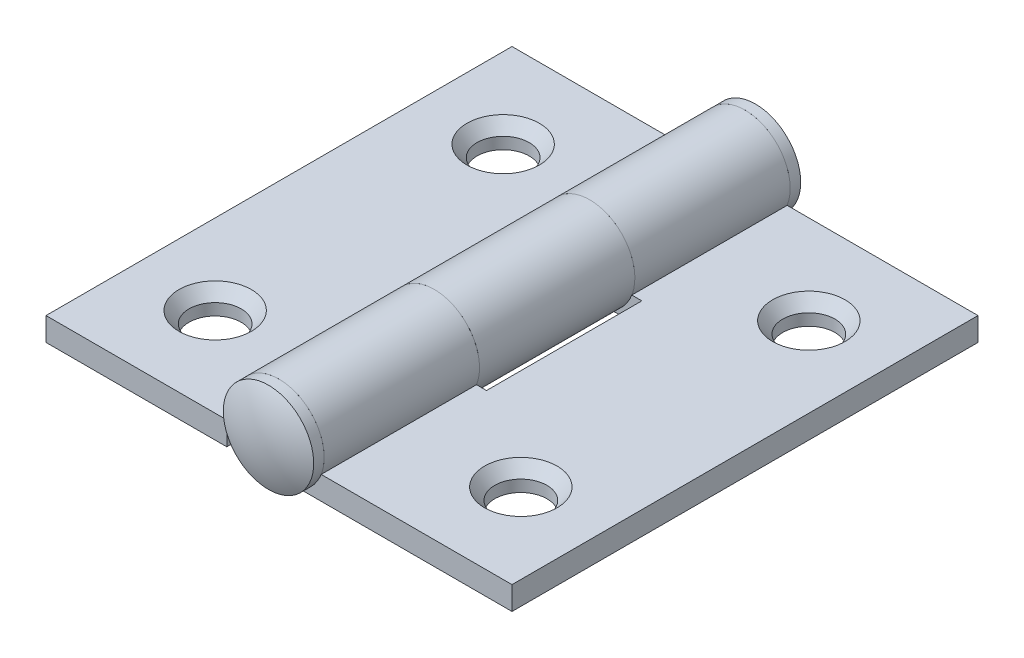
ISO-10303-21;
HEADER;
FILE_DESCRIPTION(('STEP AP214'),'2;1');
FILE_NAME('part.step','',(''),(''),'','','');
FILE_SCHEMA(('AUTOMOTIVE_DESIGN { 1 0 10303 214 1 1 1 1 }'));
ENDSEC;
DATA;
#1=APPLICATION_CONTEXT('core data for automotive mechanical design processes');
#2=APPLICATION_PROTOCOL_DEFINITION('international standard','automotive_design',2000,#1);
#3=PRODUCT_CONTEXT('',#1,'mechanical');
#4=PRODUCT('Part','Part','',(#3));
#5=PRODUCT_RELATED_PRODUCT_CATEGORY('part','',(#4));
#6=PRODUCT_DEFINITION_FORMATION('','',#4);
#7=PRODUCT_DEFINITION_CONTEXT('part definition',#1,'design');
#8=PRODUCT_DEFINITION('design','',#6,#7);
#9=PRODUCT_DEFINITION_SHAPE('','',#8);
#10=(LENGTH_UNIT() NAMED_UNIT(*) SI_UNIT(.MILLI.,.METRE.));
#11=(NAMED_UNIT(*) PLANE_ANGLE_UNIT() SI_UNIT($,.RADIAN.));
#12=(NAMED_UNIT(*) SI_UNIT($,.STERADIAN.) SOLID_ANGLE_UNIT());
#13=UNCERTAINTY_MEASURE_WITH_UNIT(LENGTH_MEASURE(1.E-05),#10,'distance_accuracy_value','');
#14=(GEOMETRIC_REPRESENTATION_CONTEXT(3) GLOBAL_UNCERTAINTY_ASSIGNED_CONTEXT((#13)) GLOBAL_UNIT_ASSIGNED_CONTEXT((#10,
#11,#12)) REPRESENTATION_CONTEXT('',''));
#15=CARTESIAN_POINT('',(0.,0.,0.));
#16=DIRECTION('',(0.,0.,1.));
#17=DIRECTION('',(1.,0.,0.));
#18=AXIS2_PLACEMENT_3D('',#15,#16,#17);
#19=CARTESIAN_POINT('',(0.,0.,-8.24639222222225));
#20=DIRECTION('',(0.,0.,-1.));
#21=DIRECTION('',(1.,0.,0.));
#22=AXIS2_PLACEMENT_3D('',#19,#20,#21);
#23=SPHERICAL_SURFACE('',#22,5.59660777777775);
#24=CARTESIAN_POINT('',(0.,0.,-13.2715));
#25=DIRECTION('',(0.,0.,-1.));
#26=DIRECTION('',(-1.,0.,0.));
#27=AXIS2_PLACEMENT_3D('',#24,#25,#26);
#28=CIRCLE('',#27,2.4638);
#29=CARTESIAN_POINT('',(-2.4638,0.,-13.2715));
#30=VERTEX_POINT('',#29);
#31=EDGE_CURVE('E70',#30,#30,#28,.T.);
#32=ORIENTED_EDGE('',*,*,#31,.T.);
#33=EDGE_LOOP('',(#32));
#34=FACE_BOUND('',#33,.T.);
#35=ADVANCED_FACE('F48',(#34),#23,.T.);
#36=CARTESIAN_POINT('',(0.,0.,8.24639222222225));
#37=DIRECTION('',(0.,0.,-1.));
#38=DIRECTION('',(-1.,0.,0.));
#39=AXIS2_PLACEMENT_3D('',#36,#37,#38);
#40=SPHERICAL_SURFACE('',#39,5.59660777777775);
#41=CARTESIAN_POINT('',(0.,0.,13.2715));
#42=DIRECTION('',(0.,0.,-1.));
#43=DIRECTION('',(-1.,0.,0.));
#44=AXIS2_PLACEMENT_3D('',#41,#42,#43);
#45=CIRCLE('',#44,2.4638);
#46=CARTESIAN_POINT('',(-2.4638,0.,13.2715));
#47=VERTEX_POINT('',#46);
#48=EDGE_CURVE('E11',#47,#47,#45,.T.);
#49=ORIENTED_EDGE('',*,*,#48,.F.);
#50=EDGE_LOOP('',(#49));
#51=FACE_BOUND('',#50,.T.);
#52=ADVANCED_FACE('F87',(#51),#40,.T.);
#53=CARTESIAN_POINT('',(0.,0.,-13.843));
#54=DIRECTION('',(0.,0.,-1.));
#55=DIRECTION('',(-1.,0.,0.));
#56=AXIS2_PLACEMENT_3D('',#53,#54,#55);
#57=CYLINDRICAL_SURFACE('',#56,2.4638);
#58=ORIENTED_EDGE('',*,*,#48,.T.);
#59=EDGE_LOOP('',(#58));
#60=FACE_BOUND('',#59,.T.);
#61=CARTESIAN_POINT('',(0.,0.,12.7));
#62=DIRECTION('',(0.,0.,-1.));
#63=DIRECTION('',(-1.,0.,0.));
#64=AXIS2_PLACEMENT_3D('',#61,#62,#63);
#65=CIRCLE('',#64,2.4638);
#66=CARTESIAN_POINT('',(-2.4638,0.,12.7));
#67=VERTEX_POINT('',#66);
#68=EDGE_CURVE('E54',#67,#67,#65,.T.);
#69=ORIENTED_EDGE('',*,*,#68,.F.);
#70=EDGE_LOOP('',(#69));
#71=FACE_BOUND('',#70,.T.);
#72=ADVANCED_FACE('F91',(#60,#71),#57,.T.);
#73=CARTESIAN_POINT('',(-1.190625,0.,12.7));
#74=DIRECTION('',(0.,0.,-1.));
#75=DIRECTION('',(-1.,0.,0.));
#76=AXIS2_PLACEMENT_3D('',#73,#74,#75);
#77=PLANE('',#76);
#78=ORIENTED_EDGE('',*,*,#68,.T.);
#79=EDGE_LOOP('',(#78));
#80=FACE_BOUND('',#79,.T.);
#81=CARTESIAN_POINT('',(0.,0.,12.7));
#82=DIRECTION('',(0.,0.,-1.));
#83=DIRECTION('',(-1.,0.,0.));
#84=AXIS2_PLACEMENT_3D('',#81,#82,#83);
#85=CIRCLE('',#84,1.190625);
#86=CARTESIAN_POINT('',(-1.190625,0.,12.7));
#87=VERTEX_POINT('',#86);
#88=EDGE_CURVE('E58',#87,#87,#85,.T.);
#89=ORIENTED_EDGE('',*,*,#88,.F.);
#90=EDGE_LOOP('',(#89));
#91=FACE_BOUND('',#90,.T.);
#92=ADVANCED_FACE('F96',(#80,#91),#77,.T.);
#93=CARTESIAN_POINT('',(0.,0.,-13.843));
#94=DIRECTION('',(0.,0.,-1.));
#95=DIRECTION('',(-1.,0.,0.));
#96=AXIS2_PLACEMENT_3D('',#93,#94,#95);
#97=CYLINDRICAL_SURFACE('',#96,1.190625);
#98=ORIENTED_EDGE('',*,*,#88,.T.);
#99=EDGE_LOOP('',(#98));
#100=FACE_BOUND('',#99,.T.);
#101=CARTESIAN_POINT('',(0.,0.,-12.7));
#102=DIRECTION('',(0.,0.,-1.));
#103=DIRECTION('',(-1.,0.,0.));
#104=AXIS2_PLACEMENT_3D('',#101,#102,#103);
#105=CIRCLE('',#104,1.190625);
#106=CARTESIAN_POINT('',(-1.190625,0.,-12.7));
#107=VERTEX_POINT('',#106);
#108=EDGE_CURVE('E62',#107,#107,#105,.T.);
#109=ORIENTED_EDGE('',*,*,#108,.F.);
#110=EDGE_LOOP('',(#109));
#111=FACE_BOUND('',#110,.T.);
#112=ADVANCED_FACE('F83',(#100,#111),#97,.T.);
#113=CARTESIAN_POINT('',(-2.4638,0.,-12.7));
#114=DIRECTION('',(0.,0.,1.));
#115=DIRECTION('',(1.,0.,0.));
#116=AXIS2_PLACEMENT_3D('',#113,#114,#115);
#117=PLANE('',#116);
#118=ORIENTED_EDGE('',*,*,#108,.T.);
#119=EDGE_LOOP('',(#118));
#120=FACE_BOUND('',#119,.T.);
#121=CARTESIAN_POINT('',(0.,0.,-12.7));
#122=DIRECTION('',(0.,0.,-1.));
#123=DIRECTION('',(-1.,0.,0.));
#124=AXIS2_PLACEMENT_3D('',#121,#122,#123);
#125=CIRCLE('',#124,2.4638);
#126=CARTESIAN_POINT('',(-2.4638,0.,-12.7));
#127=VERTEX_POINT('',#126);
#128=EDGE_CURVE('E67',#127,#127,#125,.T.);
#129=ORIENTED_EDGE('',*,*,#128,.F.);
#130=EDGE_LOOP('',(#129));
#131=FACE_BOUND('',#130,.T.);
#132=ADVANCED_FACE('F77',(#120,#131),#117,.T.);
#133=CARTESIAN_POINT('',(0.,0.,-13.843));
#134=DIRECTION('',(0.,0.,-1.));
#135=DIRECTION('',(-1.,0.,0.));
#136=AXIS2_PLACEMENT_3D('',#133,#134,#135);
#137=CYLINDRICAL_SURFACE('',#136,2.4638);
#138=ORIENTED_EDGE('',*,*,#128,.T.);
#139=EDGE_LOOP('',(#138));
#140=FACE_BOUND('',#139,.T.);
#141=ORIENTED_EDGE('',*,*,#31,.F.);
#142=EDGE_LOOP('',(#141));
#143=FACE_BOUND('',#142,.T.);
#144=ADVANCED_FACE('F75',(#140,#143),#137,.T.);
#145=CLOSED_SHELL('',(#35,#52,#72,#92,#112,#132,#144));
#146=MANIFOLD_SOLID_BREP('B2',#145);
#147=CARTESIAN_POINT('',(-2.8448,-0.88701704893008,12.7));
#148=DIRECTION('',(-1.,0.,0.));
#149=DIRECTION('',(0.,-1.,0.));
#150=AXIS2_PLACEMENT_3D('',#147,#148,#149);
#151=PLANE('',#150);
#152=DIRECTION('',(0.,-1.,0.));
#153=VECTOR('',#152,1.);
#154=CARTESIAN_POINT('',(-2.8448,-0.88701704893008,4.23333333333334));
#155=LINE('',#154,#153);
#156=CARTESIAN_POINT('',(-2.8448,-0.88701704893008,4.23333333333334));
#157=VERTEX_POINT('',#156);
#158=CARTESIAN_POINT('',(-2.8448,-2.15701704893008,4.23333333333334));
#159=VERTEX_POINT('',#158);
#160=EDGE_CURVE('E255',#157,#159,#155,.T.);
#161=ORIENTED_EDGE('',*,*,#160,.F.);
#162=DIRECTION('',(0.,0.,-1.));
#163=VECTOR('',#162,1.);
#164=CARTESIAN_POINT('',(-2.8448,-0.88701704893008,12.7));
#165=LINE('',#164,#163);
#166=CARTESIAN_POINT('',(-2.8448,-0.88701704893008,12.7));
#167=VERTEX_POINT('',#166);
#168=EDGE_CURVE('E293',#167,#157,#165,.T.);
#169=ORIENTED_EDGE('',*,*,#168,.F.);
#170=DIRECTION('',(0.,1.,0.));
#171=VECTOR('',#170,1.);
#172=CARTESIAN_POINT('',(-2.8448,-0.88701704893008,12.7));
#173=LINE('',#172,#171);
#174=CARTESIAN_POINT('',(-2.8448,-2.15701704893008,12.7));
#175=VERTEX_POINT('',#174);
#176=EDGE_CURVE('E377',#175,#167,#173,.T.);
#177=ORIENTED_EDGE('',*,*,#176,.F.);
#178=DIRECTION('',(0.,0.,-1.));
#179=VECTOR('',#178,1.);
#180=CARTESIAN_POINT('',(-2.8448,-2.15701704893008,12.7));
#181=LINE('',#180,#179);
#182=EDGE_CURVE('E302',#175,#159,#181,.T.);
#183=ORIENTED_EDGE('',*,*,#182,.T.);
#184=EDGE_LOOP('',(#161,#169,#177,#183));
#185=FACE_BOUND('',#184,.T.);
#186=ADVANCED_FACE('F158',(#185),#151,.F.);
#187=CARTESIAN_POINT('',(-12.7,-0.88701704893008,12.7));
#188=DIRECTION('',(1.,0.,0.));
#189=DIRECTION('',(0.,0.,-1.));
#190=AXIS2_PLACEMENT_3D('',#187,#188,#189);
#191=PLANE('',#190);
#192=DIRECTION('',(0.,-1.,0.));
#193=VECTOR('',#192,1.);
#194=CARTESIAN_POINT('',(-12.7,-0.88701704893008,-12.7));
#195=LINE('',#194,#193);
#196=CARTESIAN_POINT('',(-12.7,-0.88701704893008,-12.7));
#197=VERTEX_POINT('',#196);
#198=CARTESIAN_POINT('',(-12.7,-2.15701704893008,-12.7));
#199=VERTEX_POINT('',#198);
#200=EDGE_CURVE('E368',#197,#199,#195,.T.);
#201=ORIENTED_EDGE('',*,*,#200,.T.);
#202=DIRECTION('',(0.,0.,-1.));
#203=VECTOR('',#202,1.);
#204=CARTESIAN_POINT('',(-12.7,-2.15701704893008,12.7));
#205=LINE('',#204,#203);
#206=CARTESIAN_POINT('',(-12.7,-2.15701704893008,12.7));
#207=VERTEX_POINT('',#206);
#208=EDGE_CURVE('E310',#207,#199,#205,.T.);
#209=ORIENTED_EDGE('',*,*,#208,.F.);
#210=DIRECTION('',(0.,-1.,0.));
#211=VECTOR('',#210,1.);
#212=CARTESIAN_POINT('',(-12.7,-0.88701704893008,12.7));
#213=LINE('',#212,#211);
#214=CARTESIAN_POINT('',(-12.7,-0.88701704893008,12.7));
#215=VERTEX_POINT('',#214);
#216=EDGE_CURVE('E374',#215,#207,#213,.T.);
#217=ORIENTED_EDGE('',*,*,#216,.F.);
#218=DIRECTION('',(0.,0.,-1.));
#219=VECTOR('',#218,1.);
#220=CARTESIAN_POINT('',(-12.7,-0.88701704893008,12.7));
#221=LINE('',#220,#219);
#222=EDGE_CURVE('E294',#215,#197,#221,.T.);
#223=ORIENTED_EDGE('',*,*,#222,.T.);
#224=EDGE_LOOP('',(#201,#209,#217,#223));
#225=FACE_BOUND('',#224,.T.);
#226=ADVANCED_FACE('F343',(#225),#191,.F.);
#227=CARTESIAN_POINT('',(-12.7,-2.15701704893008,12.7));
#228=DIRECTION('',(0.,1.,0.));
#229=DIRECTION('',(0.,0.,1.));
#230=AXIS2_PLACEMENT_3D('',#227,#228,#229);
#231=PLANE('',#230);
#232=CARTESIAN_POINT('',(-8.3312,-2.15701704893008,7.8486));
#233=DIRECTION('',(0.,1.,0.));
#234=DIRECTION('',(0.,0.,1.));
#235=AXIS2_PLACEMENT_3D('',#232,#233,#234);
#236=CIRCLE('',#235,1.4224);
#237=CARTESIAN_POINT('',(-8.3312,-2.15701704893008,9.271));
#238=VERTEX_POINT('',#237);
#239=EDGE_CURVE('E363',#238,#238,#236,.T.);
#240=ORIENTED_EDGE('',*,*,#239,.T.);
#241=EDGE_LOOP('',(#240));
#242=FACE_BOUND('',#241,.T.);
#243=CARTESIAN_POINT('',(-8.3312,-2.15701704893008,-7.8486));
#244=DIRECTION('',(0.,1.,0.));
#245=DIRECTION('',(0.,0.,1.));
#246=AXIS2_PLACEMENT_3D('',#243,#244,#245);
#247=CIRCLE('',#246,1.4224);
#248=CARTESIAN_POINT('',(-8.3312,-2.15701704893008,-6.4262));
#249=VERTEX_POINT('',#248);
#250=EDGE_CURVE('E366',#249,#249,#247,.T.);
#251=ORIENTED_EDGE('',*,*,#250,.T.);
#252=EDGE_LOOP('',(#251));
#253=FACE_BOUND('',#252,.T.);
#254=DIRECTION('',(1.,0.,0.));
#255=VECTOR('',#254,1.);
#256=CARTESIAN_POINT('',(-12.7,-2.15701704893008,-12.7));
#257=LINE('',#256,#255);
#258=CARTESIAN_POINT('',(-2.8448,-2.15701704893008,-12.7));
#259=VERTEX_POINT('',#258);
#260=EDGE_CURVE('E370',#199,#259,#257,.T.);
#261=ORIENTED_EDGE('',*,*,#260,.T.);
#262=CARTESIAN_POINT('',(-2.8448,-2.15701704893008,-4.23333333333334));
#263=VERTEX_POINT('',#262);
#264=EDGE_CURVE('E297',#263,#259,#181,.T.);
#265=ORIENTED_EDGE('',*,*,#264,.F.);
#266=DIRECTION('',(1.,0.,0.));
#267=VECTOR('',#266,1.);
#268=CARTESIAN_POINT('',(-2.8448,-2.15701704893008,-4.23333333333334));
#269=LINE('',#268,#267);
#270=CARTESIAN_POINT('',(-1.190625,-2.15701704893007,-4.23333333333334));
#271=VERTEX_POINT('',#270);
#272=EDGE_CURVE('E175',#263,#271,#269,.T.);
#273=ORIENTED_EDGE('',*,*,#272,.T.);
#274=DIRECTION('',(0.,0.,-1.));
#275=VECTOR('',#274,1.);
#276=CARTESIAN_POINT('',(-1.190625,-2.15701704893007,11.4764318222399));
#277=LINE('',#276,#275);
#278=CARTESIAN_POINT('',(-1.190625,-2.15701704893007,4.23333333333334));
#279=VERTEX_POINT('',#278);
#280=EDGE_CURVE('E233',#279,#271,#277,.T.);
#281=ORIENTED_EDGE('',*,*,#280,.F.);
#282=DIRECTION('',(1.,0.,0.));
#283=VECTOR('',#282,1.);
#284=CARTESIAN_POINT('',(-2.8448,-2.15701704893008,4.23333333333334));
#285=LINE('',#284,#283);
#286=EDGE_CURVE('E238',#159,#279,#285,.T.);
#287=ORIENTED_EDGE('',*,*,#286,.F.);
#288=ORIENTED_EDGE('',*,*,#182,.F.);
#289=DIRECTION('',(1.,0.,0.));
#290=VECTOR('',#289,1.);
#291=CARTESIAN_POINT('',(-12.7,-2.15701704893008,12.7));
#292=LINE('',#291,#290);
#293=EDGE_CURVE('E212',#207,#175,#292,.T.);
#294=ORIENTED_EDGE('',*,*,#293,.F.);
#295=ORIENTED_EDGE('',*,*,#208,.T.);
#296=EDGE_LOOP('',(#261,#265,#273,#281,#287,#288,#294,#295));
#297=FACE_BOUND('',#296,.T.);
#298=ADVANCED_FACE('F236',(#242,#253,#297),#231,.F.);
#299=CARTESIAN_POINT('',(-2.8448,-0.88701704893008,-4.23333333333334));
#300=VERTEX_POINT('',#299);
#301=CARTESIAN_POINT('',(-2.8448,-0.88701704893008,-12.7));
#302=VERTEX_POINT('',#301);
#303=EDGE_CURVE('E285',#300,#302,#165,.T.);
#304=ORIENTED_EDGE('',*,*,#303,.F.);
#305=DIRECTION('',(0.,-1.,0.));
#306=VECTOR('',#305,1.);
#307=CARTESIAN_POINT('',(-2.8448,-0.88701704893008,-4.23333333333334));
#308=LINE('',#307,#306);
#309=EDGE_CURVE('E278',#300,#263,#308,.T.);
#310=ORIENTED_EDGE('',*,*,#309,.T.);
#311=ORIENTED_EDGE('',*,*,#264,.T.);
#312=DIRECTION('',(0.,1.,0.));
#313=VECTOR('',#312,1.);
#314=CARTESIAN_POINT('',(-2.8448,-0.88701704893008,-12.7));
#315=LINE('',#314,#313);
#316=EDGE_CURVE('E292',#259,#302,#315,.T.);
#317=ORIENTED_EDGE('',*,*,#316,.T.);
#318=EDGE_LOOP('',(#304,#310,#311,#317));
#319=FACE_BOUND('',#318,.T.);
#320=ADVANCED_FACE('F290',(#319),#151,.F.);
#321=CARTESIAN_POINT('',(-12.7,-0.88701704893008,12.7));
#322=DIRECTION('',(0.,-1.,0.));
#323=DIRECTION('',(1.,0.,0.));
#324=AXIS2_PLACEMENT_3D('',#321,#322,#323);
#325=PLANE('',#324);
#326=CARTESIAN_POINT('',(-8.3312,-0.88701704893008,7.8486));
#327=DIRECTION('',(0.,-1.,0.));
#328=DIRECTION('',(1.,0.,0.));
#329=AXIS2_PLACEMENT_3D('',#326,#327,#328);
#330=CIRCLE('',#329,1.9743970785133);
#331=CARTESIAN_POINT('',(-6.3568029214867,-0.88701704893008,7.8486));
#332=VERTEX_POINT('',#331);
#333=EDGE_CURVE('E167',#332,#332,#330,.T.);
#334=ORIENTED_EDGE('',*,*,#333,.T.);
#335=EDGE_LOOP('',(#334));
#336=FACE_BOUND('',#335,.T.);
#337=CARTESIAN_POINT('',(-8.3312,-0.88701704893008,-7.8486));
#338=DIRECTION('',(0.,-1.,0.));
#339=DIRECTION('',(1.,0.,0.));
#340=AXIS2_PLACEMENT_3D('',#337,#338,#339);
#341=CIRCLE('',#340,1.9743970785133);
#342=CARTESIAN_POINT('',(-6.3568029214867,-0.88701704893008,-7.8486));
#343=VERTEX_POINT('',#342);
#344=EDGE_CURVE('E319',#343,#343,#341,.T.);
#345=ORIENTED_EDGE('',*,*,#344,.T.);
#346=EDGE_LOOP('',(#345));
#347=FACE_BOUND('',#346,.T.);
#348=DIRECTION('',(-1.,0.,0.));
#349=VECTOR('',#348,1.);
#350=CARTESIAN_POINT('',(-12.7,-0.88701704893008,-12.7));
#351=LINE('',#350,#349);
#352=EDGE_CURVE('E204',#302,#197,#351,.T.);
#353=ORIENTED_EDGE('',*,*,#352,.T.);
#354=ORIENTED_EDGE('',*,*,#222,.F.);
#355=DIRECTION('',(-1.,0.,0.));
#356=VECTOR('',#355,1.);
#357=CARTESIAN_POINT('',(-12.7,-0.88701704893008,12.7));
#358=LINE('',#357,#356);
#359=EDGE_CURVE('E184',#167,#215,#358,.T.);
#360=ORIENTED_EDGE('',*,*,#359,.F.);
#361=ORIENTED_EDGE('',*,*,#168,.T.);
#362=DIRECTION('',(-1.,0.,0.));
#363=VECTOR('',#362,1.);
#364=CARTESIAN_POINT('',(-2.29858895736219,-0.887017048930075,4.23333333333334));
#365=LINE('',#364,#363);
#366=CARTESIAN_POINT('',(-2.29858895736219,-0.887017048930075,4.23333333333334));
#367=VERTEX_POINT('',#366);
#368=EDGE_CURVE('E251',#367,#157,#365,.T.);
#369=ORIENTED_EDGE('',*,*,#368,.F.);
#370=DIRECTION('',(0.,0.,-1.));
#371=VECTOR('',#370,1.);
#372=CARTESIAN_POINT('',(-2.29858895736219,-0.887017048930075,11.4764318222399));
#373=LINE('',#372,#371);
#374=CARTESIAN_POINT('',(-2.29858895736219,-0.887017048930075,-4.23333333333334));
#375=VERTEX_POINT('',#374);
#376=EDGE_CURVE('E243',#367,#375,#373,.T.);
#377=ORIENTED_EDGE('',*,*,#376,.T.);
#378=DIRECTION('',(-1.,0.,0.));
#379=VECTOR('',#378,1.);
#380=CARTESIAN_POINT('',(-2.29858895736219,-0.887017048930075,-4.23333333333334));
#381=LINE('',#380,#379);
#382=EDGE_CURVE('E274',#375,#300,#381,.T.);
#383=ORIENTED_EDGE('',*,*,#382,.T.);
#384=ORIENTED_EDGE('',*,*,#303,.T.);
#385=EDGE_LOOP('',(#353,#354,#360,#361,#369,#377,#383,#384));
#386=FACE_BOUND('',#385,.T.);
#387=ADVANCED_FACE('F283',(#336,#347,#386),#325,.F.);
#388=CARTESIAN_POINT('',(-12.7,-2.15701704893008,12.7));
#389=DIRECTION('',(0.,0.,1.));
#390=DIRECTION('',(1.,0.,0.));
#391=AXIS2_PLACEMENT_3D('',#388,#389,#390);
#392=PLANE('',#391);
#393=ORIENTED_EDGE('',*,*,#216,.T.);
#394=ORIENTED_EDGE('',*,*,#293,.T.);
#395=ORIENTED_EDGE('',*,*,#176,.T.);
#396=ORIENTED_EDGE('',*,*,#359,.T.);
#397=EDGE_LOOP('',(#393,#394,#395,#396));
#398=FACE_BOUND('',#397,.T.);
#399=ADVANCED_FACE('F356',(#398),#392,.T.);
#400=CARTESIAN_POINT('',(-12.7,-2.15701704893008,-12.7));
#401=DIRECTION('',(0.,0.,1.));
#402=DIRECTION('',(1.,0.,0.));
#403=AXIS2_PLACEMENT_3D('',#400,#401,#402);
#404=PLANE('',#403);
#405=ORIENTED_EDGE('',*,*,#200,.F.);
#406=ORIENTED_EDGE('',*,*,#352,.F.);
#407=ORIENTED_EDGE('',*,*,#316,.F.);
#408=ORIENTED_EDGE('',*,*,#260,.F.);
#409=EDGE_LOOP('',(#405,#406,#407,#408));
#410=FACE_BOUND('',#409,.T.);
#411=ADVANCED_FACE('F383',(#410),#404,.F.);
#412=CARTESIAN_POINT('',(-8.3312,-2.4638,-7.8486));
#413=DIRECTION('',(0.,1.,0.));
#414=DIRECTION('',(0.,0.,1.));
#415=AXIS2_PLACEMENT_3D('',#412,#413,#414);
#416=CYLINDRICAL_SURFACE('',#415,1.4224);
#417=CARTESIAN_POINT('',(-8.3312,-1.52201704893008,-7.8486));
#418=DIRECTION('',(0.,-1.,0.));
#419=DIRECTION('',(0.,0.,-1.));
#420=AXIS2_PLACEMENT_3D('',#417,#418,#419);
#421=CIRCLE('',#420,1.4224);
#422=CARTESIAN_POINT('',(-8.3312,-1.52201704893008,-9.271));
#423=VERTEX_POINT('',#422);
#424=EDGE_CURVE('E46',#423,#423,#421,.F.);
#425=ORIENTED_EDGE('',*,*,#424,.T.);
#426=EDGE_LOOP('',(#425));
#427=FACE_BOUND('',#426,.T.);
#428=ORIENTED_EDGE('',*,*,#250,.F.);
#429=EDGE_LOOP('',(#428));
#430=FACE_BOUND('',#429,.T.);
#431=ADVANCED_FACE('F339',(#427,#430),#416,.F.);
#432=CARTESIAN_POINT('',(-8.3312,-2.4638,7.8486));
#433=DIRECTION('',(0.,1.,0.));
#434=DIRECTION('',(0.,0.,1.));
#435=AXIS2_PLACEMENT_3D('',#432,#433,#434);
#436=CYLINDRICAL_SURFACE('',#435,1.4224);
#437=CARTESIAN_POINT('',(-8.3312,-1.52201704893008,7.8486));
#438=DIRECTION('',(0.,-1.,0.));
#439=DIRECTION('',(0.,0.,-1.));
#440=AXIS2_PLACEMENT_3D('',#437,#438,#439);
#441=CIRCLE('',#440,1.4224);
#442=CARTESIAN_POINT('',(-8.3312,-1.52201704893008,6.4262));
#443=VERTEX_POINT('',#442);
#444=EDGE_CURVE('E315',#443,#443,#441,.F.);
#445=ORIENTED_EDGE('',*,*,#444,.T.);
#446=EDGE_LOOP('',(#445));
#447=FACE_BOUND('',#446,.T.);
#448=ORIENTED_EDGE('',*,*,#239,.F.);
#449=EDGE_LOOP('',(#448));
#450=FACE_BOUND('',#449,.T.);
#451=ADVANCED_FACE('F333',(#447,#450),#436,.F.);
#452=CARTESIAN_POINT('',(-8.3312,-1.52201704893008,7.8486));
#453=DIRECTION('',(0.,1.,0.));
#454=DIRECTION('',(0.,0.,1.));
#455=AXIS2_PLACEMENT_3D('',#452,#453,#454);
#456=CONICAL_SURFACE('',#455,1.4224,0.715584993317671);
#457=ORIENTED_EDGE('',*,*,#333,.F.);
#458=EDGE_LOOP('',(#457));
#459=FACE_BOUND('',#458,.T.);
#460=ORIENTED_EDGE('',*,*,#444,.F.);
#461=EDGE_LOOP('',(#460));
#462=FACE_BOUND('',#461,.T.);
#463=ADVANCED_FACE('F330',(#459,#462),#456,.F.);
#464=CARTESIAN_POINT('',(-8.3312,-1.52201704893008,-7.8486));
#465=DIRECTION('',(0.,1.,0.));
#466=DIRECTION('',(0.,0.,1.));
#467=AXIS2_PLACEMENT_3D('',#464,#465,#466);
#468=CONICAL_SURFACE('',#467,1.4224,0.715584993317673);
#469=ORIENTED_EDGE('',*,*,#344,.F.);
#470=EDGE_LOOP('',(#469));
#471=FACE_BOUND('',#470,.T.);
#472=ORIENTED_EDGE('',*,*,#424,.F.);
#473=EDGE_LOOP('',(#472));
#474=FACE_BOUND('',#473,.T.);
#475=ADVANCED_FACE('F160',(#471,#474),#468,.F.);
#476=CARTESIAN_POINT('',(0.,0.,11.4764318222399));
#477=DIRECTION('',(0.,0.,-1.));
#478=DIRECTION('',(-1.,0.,0.));
#479=AXIS2_PLACEMENT_3D('',#476,#477,#478);
#480=CYLINDRICAL_SURFACE('',#479,2.4638);
#481=CARTESIAN_POINT('',(0.,0.,4.23333333333334));
#482=DIRECTION('',(0.,0.,1.));
#483=DIRECTION('',(1.,0.,0.));
#484=AXIS2_PLACEMENT_3D('',#481,#482,#483);
#485=CIRCLE('',#484,2.4638);
#486=EDGE_CURVE('E247',#279,#367,#485,.T.);
#487=ORIENTED_EDGE('',*,*,#486,.F.);
#488=ORIENTED_EDGE('',*,*,#280,.T.);
#489=CARTESIAN_POINT('',(0.,0.,-4.23333333333334));
#490=DIRECTION('',(0.,0.,1.));
#491=DIRECTION('',(1.,0.,0.));
#492=AXIS2_PLACEMENT_3D('',#489,#490,#491);
#493=CIRCLE('',#492,2.4638);
#494=EDGE_CURVE('E272',#271,#375,#493,.T.);
#495=ORIENTED_EDGE('',*,*,#494,.T.);
#496=ORIENTED_EDGE('',*,*,#376,.F.);
#497=EDGE_LOOP('',(#487,#488,#495,#496));
#498=FACE_BOUND('',#497,.T.);
#499=ADVANCED_FACE('F248',(#498),#480,.T.);
#500=CARTESIAN_POINT('',(0.,0.,-4.23333333333334));
#501=DIRECTION('',(0.,0.,1.));
#502=DIRECTION('',(1.,0.,0.));
#503=AXIS2_PLACEMENT_3D('',#500,#501,#502);
#504=PLANE('',#503);
#505=ORIENTED_EDGE('',*,*,#494,.F.);
#506=ORIENTED_EDGE('',*,*,#272,.F.);
#507=ORIENTED_EDGE('',*,*,#309,.F.);
#508=ORIENTED_EDGE('',*,*,#382,.F.);
#509=EDGE_LOOP('',(#505,#506,#507,#508));
#510=FACE_BOUND('',#509,.T.);
#511=CARTESIAN_POINT('',(0.,0.,-4.23333333333334));
#512=DIRECTION('',(0.,0.,1.));
#513=DIRECTION('',(1.,0.,0.));
#514=AXIS2_PLACEMENT_3D('',#511,#512,#513);
#515=CIRCLE('',#514,1.190625);
#516=CARTESIAN_POINT('',(1.190625,0.,-4.23333333333334));
#517=VERTEX_POINT('',#516);
#518=EDGE_CURVE('E250',#517,#517,#515,.T.);
#519=ORIENTED_EDGE('',*,*,#518,.T.);
#520=EDGE_LOOP('',(#519));
#521=FACE_BOUND('',#520,.T.);
#522=ADVANCED_FACE('F287',(#510,#521),#504,.F.);
#523=CARTESIAN_POINT('',(0.,0.,11.4764318222399));
#524=DIRECTION('',(0.,0.,-1.));
#525=DIRECTION('',(-1.,0.,0.));
#526=AXIS2_PLACEMENT_3D('',#523,#524,#525);
#527=CYLINDRICAL_SURFACE('',#526,1.190625);
#528=ORIENTED_EDGE('',*,*,#518,.F.);
#529=EDGE_LOOP('',(#528));
#530=FACE_BOUND('',#529,.T.);
#531=CARTESIAN_POINT('',(0.,0.,4.23333333333334));
#532=DIRECTION('',(0.,0.,1.));
#533=DIRECTION('',(1.,0.,0.));
#534=AXIS2_PLACEMENT_3D('',#531,#532,#533);
#535=CIRCLE('',#534,1.190625);
#536=CARTESIAN_POINT('',(1.190625,0.,4.23333333333334));
#537=VERTEX_POINT('',#536);
#538=EDGE_CURVE('E257',#537,#537,#535,.T.);
#539=ORIENTED_EDGE('',*,*,#538,.T.);
#540=EDGE_LOOP('',(#539));
#541=FACE_BOUND('',#540,.T.);
#542=ADVANCED_FACE('F400',(#530,#541),#527,.F.);
#543=CARTESIAN_POINT('',(-2.84479999999998,-2.4638,4.23333333333334));
#544=DIRECTION('',(0.,0.,1.));
#545=DIRECTION('',(1.,0.,0.));
#546=AXIS2_PLACEMENT_3D('',#543,#544,#545);
#547=PLANE('',#546);
#548=ORIENTED_EDGE('',*,*,#538,.F.);
#549=EDGE_LOOP('',(#548));
#550=FACE_BOUND('',#549,.T.);
#551=ORIENTED_EDGE('',*,*,#286,.T.);
#552=ORIENTED_EDGE('',*,*,#486,.T.);
#553=ORIENTED_EDGE('',*,*,#368,.T.);
#554=ORIENTED_EDGE('',*,*,#160,.T.);
#555=EDGE_LOOP('',(#551,#552,#553,#554));
#556=FACE_BOUND('',#555,.T.);
#557=ADVANCED_FACE('F253',(#550,#556),#547,.T.);
#558=CLOSED_SHELL('',(#186,#226,#298,#320,#387,#399,#411,#431,#451,#463,#475,#499,#522,#542,#557));
#559=MANIFOLD_SOLID_BREP('B6',#558);
#560=CARTESIAN_POINT('',(0.,0.,12.7));
#561=DIRECTION('',(0.,0.,-1.));
#562=DIRECTION('',(-1.,0.,0.));
#563=AXIS2_PLACEMENT_3D('',#560,#561,#562);
#564=CYLINDRICAL_SURFACE('',#563,2.4638);
#565=CARTESIAN_POINT('',(0.,0.,4.23333333333334));
#566=DIRECTION('',(0.,0.,1.));
#567=DIRECTION('',(1.,0.,0.));
#568=AXIS2_PLACEMENT_3D('',#565,#566,#567);
#569=CIRCLE('',#568,2.4638);
#570=CARTESIAN_POINT('',(2.29858895736219,-0.887017048930075,4.23333333333334));
#571=VERTEX_POINT('',#570);
#572=CARTESIAN_POINT('',(1.190625,-2.15701704893007,4.23333333333334));
#573=VERTEX_POINT('',#572);
#574=EDGE_CURVE('E577',#571,#573,#569,.T.);
#575=ORIENTED_EDGE('',*,*,#574,.T.);
#576=DIRECTION('',(0.,0.,-1.));
#577=VECTOR('',#576,1.);
#578=CARTESIAN_POINT('',(1.190625,-2.15701704893007,12.7));
#579=LINE('',#578,#577);
#580=CARTESIAN_POINT('',(1.190625,-2.15701704893007,12.7));
#581=VERTEX_POINT('',#580);
#582=EDGE_CURVE('E643',#581,#573,#579,.T.);
#583=ORIENTED_EDGE('',*,*,#582,.F.);
#584=CARTESIAN_POINT('',(0.,0.,12.7));
#585=DIRECTION('',(0.,0.,1.));
#586=DIRECTION('',(-1.,0.,0.));
#587=AXIS2_PLACEMENT_3D('',#584,#585,#586);
#588=CIRCLE('',#587,2.4638);
#589=CARTESIAN_POINT('',(2.29858895736219,-0.887017048930075,12.7));
#590=VERTEX_POINT('',#589);
#591=EDGE_CURVE('E628',#590,#581,#588,.T.);
#592=ORIENTED_EDGE('',*,*,#591,.F.);
#593=DIRECTION('',(0.,0.,-1.));
#594=VECTOR('',#593,1.);
#595=CARTESIAN_POINT('',(2.29858895736219,-0.887017048930075,12.7));
#596=LINE('',#595,#594);
#597=EDGE_CURVE('E647',#590,#571,#596,.T.);
#598=ORIENTED_EDGE('',*,*,#597,.T.);
#599=EDGE_LOOP('',(#575,#583,#592,#598));
#600=FACE_BOUND('',#599,.T.);
#601=ADVANCED_FACE('F502',(#600),#564,.T.);
#602=CARTESIAN_POINT('',(0.,0.,12.7));
#603=DIRECTION('',(0.,0.,-1.));
#604=DIRECTION('',(-1.,0.,0.));
#605=AXIS2_PLACEMENT_3D('',#602,#603,#604);
#606=CYLINDRICAL_SURFACE('',#605,1.190625);
#607=CARTESIAN_POINT('',(0.,0.,-4.23333333333334));
#608=DIRECTION('',(0.,0.,-1.));
#609=DIRECTION('',(-1.,0.,0.));
#610=AXIS2_PLACEMENT_3D('',#607,#608,#609);
#611=CIRCLE('',#610,1.190625);
#612=CARTESIAN_POINT('',(-1.190625,0.,-4.23333333333334));
#613=VERTEX_POINT('',#612);
#614=EDGE_CURVE('E580',#613,#613,#611,.T.);
#615=ORIENTED_EDGE('',*,*,#614,.F.);
#616=EDGE_LOOP('',(#615));
#617=FACE_BOUND('',#616,.T.);
#618=CARTESIAN_POINT('',(0.,0.,-12.7));
#619=DIRECTION('',(0.,0.,1.));
#620=DIRECTION('',(1.,0.,0.));
#621=AXIS2_PLACEMENT_3D('',#618,#619,#620);
#622=CIRCLE('',#621,1.190625);
#623=CARTESIAN_POINT('',(1.190625,0.,-12.7));
#624=VERTEX_POINT('',#623);
#625=EDGE_CURVE('E618',#624,#624,#622,.T.);
#626=ORIENTED_EDGE('',*,*,#625,.F.);
#627=EDGE_LOOP('',(#626));
#628=FACE_BOUND('',#627,.T.);
#629=ADVANCED_FACE('F692',(#617,#628),#606,.F.);
#630=CARTESIAN_POINT('',(12.7,-0.887017048930074,12.7));
#631=DIRECTION('',(0.,-1.,0.));
#632=DIRECTION('',(1.,0.,0.));
#633=AXIS2_PLACEMENT_3D('',#630,#631,#632);
#634=PLANE('',#633);
#635=CARTESIAN_POINT('',(2.29858895736219,-0.887017048930075,-4.23333333333334));
#636=VERTEX_POINT('',#635);
#637=CARTESIAN_POINT('',(2.29858895736219,-0.887017048930075,-12.7));
#638=VERTEX_POINT('',#637);
#639=EDGE_CURVE('E646',#636,#638,#596,.T.);
#640=ORIENTED_EDGE('',*,*,#639,.F.);
#641=DIRECTION('',(1.,0.,0.));
#642=VECTOR('',#641,1.);
#643=CARTESIAN_POINT('',(12.7,-0.887017048930074,-4.23333333333334));
#644=LINE('',#643,#642);
#645=CARTESIAN_POINT('',(2.84479999999998,-0.887017048930075,-4.23333333333334));
#646=VERTEX_POINT('',#645);
#647=EDGE_CURVE('E594',#636,#646,#644,.T.);
#648=ORIENTED_EDGE('',*,*,#647,.T.);
#649=DIRECTION('',(0.,0.,1.));
#650=VECTOR('',#649,1.);
#651=CARTESIAN_POINT('',(2.84479999999998,-0.887017048930075,12.7));
#652=LINE('',#651,#650);
#653=CARTESIAN_POINT('',(2.84479999999998,-0.887017048930075,4.23333333333334));
#654=VERTEX_POINT('',#653);
#655=EDGE_CURVE('E585',#646,#654,#652,.T.);
#656=ORIENTED_EDGE('',*,*,#655,.T.);
#657=DIRECTION('',(-1.,0.,0.));
#658=VECTOR('',#657,1.);
#659=CARTESIAN_POINT('',(12.7,-0.887017048930074,4.23333333333334));
#660=LINE('',#659,#658);
#661=EDGE_CURVE('E575',#654,#571,#660,.T.);
#662=ORIENTED_EDGE('',*,*,#661,.T.);
#663=ORIENTED_EDGE('',*,*,#597,.F.);
#664=DIRECTION('',(-1.,0.,0.));
#665=VECTOR('',#664,1.);
#666=CARTESIAN_POINT('',(12.7,-0.887017048930074,12.7));
#667=LINE('',#666,#665);
#668=CARTESIAN_POINT('',(12.7,-0.887017048930074,12.7));
#669=VERTEX_POINT('',#668);
#670=EDGE_CURVE('E554',#669,#590,#667,.T.);
#671=ORIENTED_EDGE('',*,*,#670,.F.);
#672=DIRECTION('',(0.,0.,-1.));
#673=VECTOR('',#672,1.);
#674=CARTESIAN_POINT('',(12.7,-0.887017048930074,12.7));
#675=LINE('',#674,#673);
#676=CARTESIAN_POINT('',(12.7,-0.887017048930074,-12.7));
#677=VERTEX_POINT('',#676);
#678=EDGE_CURVE('E510',#669,#677,#675,.T.);
#679=ORIENTED_EDGE('',*,*,#678,.T.);
#680=DIRECTION('',(-1.,0.,0.));
#681=VECTOR('',#680,1.);
#682=CARTESIAN_POINT('',(12.7,-0.887017048930074,-12.7));
#683=LINE('',#682,#681);
#684=EDGE_CURVE('E634',#677,#638,#683,.T.);
#685=ORIENTED_EDGE('',*,*,#684,.T.);
#686=EDGE_LOOP('',(#640,#648,#656,#662,#663,#671,#679,#685));
#687=FACE_BOUND('',#686,.T.);
#688=CARTESIAN_POINT('',(8.3312,-0.88701704893008,-7.8486));
#689=DIRECTION('',(0.,1.,0.));
#690=DIRECTION('',(-1.,0.,0.));
#691=AXIS2_PLACEMENT_3D('',#688,#689,#690);
#692=CIRCLE('',#691,1.9743970785133);
#693=CARTESIAN_POINT('',(6.3568029214867,-0.88701704893008,-7.8486));
#694=VERTEX_POINT('',#693);
#695=EDGE_CURVE('E609',#694,#694,#692,.T.);
#696=ORIENTED_EDGE('',*,*,#695,.F.);
#697=EDGE_LOOP('',(#696));
#698=FACE_BOUND('',#697,.T.);
#699=CARTESIAN_POINT('',(8.3312,-0.88701704893008,7.8486));
#700=DIRECTION('',(0.,1.,0.));
#701=DIRECTION('',(-1.,0.,0.));
#702=AXIS2_PLACEMENT_3D('',#699,#700,#701);
#703=CIRCLE('',#702,1.9743970785133);
#704=CARTESIAN_POINT('',(6.3568029214867,-0.88701704893008,7.8486));
#705=VERTEX_POINT('',#704);
#706=EDGE_CURVE('E595',#705,#705,#703,.T.);
#707=ORIENTED_EDGE('',*,*,#706,.F.);
#708=EDGE_LOOP('',(#707));
#709=FACE_BOUND('',#708,.T.);
#710=ADVANCED_FACE('F592',(#687,#698,#709),#634,.F.);
#711=CARTESIAN_POINT('',(0.,0.,12.7));
#712=DIRECTION('',(0.,0.,-1.));
#713=DIRECTION('',(-1.,0.,0.));
#714=AXIS2_PLACEMENT_3D('',#711,#712,#713);
#715=PLANE('',#714);
#716=DIRECTION('',(0.,1.,0.));
#717=VECTOR('',#716,1.);
#718=CARTESIAN_POINT('',(12.7,-2.15701704893007,12.7));
#719=LINE('',#718,#717);
#720=CARTESIAN_POINT('',(12.7,-2.15701704893007,12.7));
#721=VERTEX_POINT('',#720);
#722=EDGE_CURVE('E625',#721,#669,#719,.T.);
#723=ORIENTED_EDGE('',*,*,#722,.T.);
#724=ORIENTED_EDGE('',*,*,#670,.T.);
#725=ORIENTED_EDGE('',*,*,#591,.T.);
#726=DIRECTION('',(1.,0.,0.));
#727=VECTOR('',#726,1.);
#728=CARTESIAN_POINT('',(12.7,-2.15701704893007,12.7));
#729=LINE('',#728,#727);
#730=EDGE_CURVE('E526',#581,#721,#729,.T.);
#731=ORIENTED_EDGE('',*,*,#730,.T.);
#732=EDGE_LOOP('',(#723,#724,#725,#731));
#733=FACE_BOUND('',#732,.T.);
#734=CARTESIAN_POINT('',(0.,0.,12.7));
#735=DIRECTION('',(0.,0.,1.));
#736=DIRECTION('',(1.,0.,0.));
#737=AXIS2_PLACEMENT_3D('',#734,#735,#736);
#738=CIRCLE('',#737,1.190625);
#739=CARTESIAN_POINT('',(1.190625,0.,12.7));
#740=VERTEX_POINT('',#739);
#741=EDGE_CURVE('E619',#740,#740,#738,.T.);
#742=ORIENTED_EDGE('',*,*,#741,.F.);
#743=EDGE_LOOP('',(#742));
#744=FACE_BOUND('',#743,.T.);
#745=ADVANCED_FACE('F670',(#733,#744),#715,.F.);
#746=CARTESIAN_POINT('',(0.,0.,-12.7));
#747=DIRECTION('',(0.,0.,-1.));
#748=DIRECTION('',(-1.,0.,0.));
#749=AXIS2_PLACEMENT_3D('',#746,#747,#748);
#750=PLANE('',#749);
#751=DIRECTION('',(0.,1.,0.));
#752=VECTOR('',#751,1.);
#753=CARTESIAN_POINT('',(12.7,-2.15701704893007,-12.7));
#754=LINE('',#753,#752);
#755=CARTESIAN_POINT('',(12.7,-2.15701704893007,-12.7));
#756=VERTEX_POINT('',#755);
#757=EDGE_CURVE('E622',#756,#677,#754,.T.);
#758=ORIENTED_EDGE('',*,*,#757,.F.);
#759=DIRECTION('',(1.,0.,0.));
#760=VECTOR('',#759,1.);
#761=CARTESIAN_POINT('',(12.7,-2.15701704893007,-12.7));
#762=LINE('',#761,#760);
#763=CARTESIAN_POINT('',(1.190625,-2.15701704893007,-12.7));
#764=VERTEX_POINT('',#763);
#765=EDGE_CURVE('E546',#764,#756,#762,.T.);
#766=ORIENTED_EDGE('',*,*,#765,.F.);
#767=CARTESIAN_POINT('',(0.,0.,-12.7));
#768=DIRECTION('',(0.,0.,1.));
#769=DIRECTION('',(-1.,0.,0.));
#770=AXIS2_PLACEMENT_3D('',#767,#768,#769);
#771=CIRCLE('',#770,2.4638);
#772=EDGE_CURVE('E637',#638,#764,#771,.T.);
#773=ORIENTED_EDGE('',*,*,#772,.F.);
#774=ORIENTED_EDGE('',*,*,#684,.F.);
#775=EDGE_LOOP('',(#758,#766,#773,#774));
#776=FACE_BOUND('',#775,.T.);
#777=ORIENTED_EDGE('',*,*,#625,.T.);
#778=EDGE_LOOP('',(#777));
#779=FACE_BOUND('',#778,.T.);
#780=ADVANCED_FACE('F678',(#776,#779),#750,.T.);
#781=CARTESIAN_POINT('',(12.7,-2.15701704893007,12.7));
#782=DIRECTION('',(-1.,0.,0.));
#783=DIRECTION('',(0.,0.,1.));
#784=AXIS2_PLACEMENT_3D('',#781,#782,#783);
#785=PLANE('',#784);
#786=ORIENTED_EDGE('',*,*,#757,.T.);
#787=ORIENTED_EDGE('',*,*,#678,.F.);
#788=ORIENTED_EDGE('',*,*,#722,.F.);
#789=DIRECTION('',(0.,0.,-1.));
#790=VECTOR('',#789,1.);
#791=CARTESIAN_POINT('',(12.7,-2.15701704893007,12.7));
#792=LINE('',#791,#790);
#793=EDGE_CURVE('E631',#721,#756,#792,.T.);
#794=ORIENTED_EDGE('',*,*,#793,.T.);
#795=EDGE_LOOP('',(#786,#787,#788,#794));
#796=FACE_BOUND('',#795,.T.);
#797=ADVANCED_FACE('F504',(#796),#785,.F.);
#798=CARTESIAN_POINT('',(1.190625,-2.15701704893007,-4.23333333333334));
#799=VERTEX_POINT('',#798);
#800=EDGE_CURVE('E642',#799,#764,#579,.T.);
#801=ORIENTED_EDGE('',*,*,#800,.F.);
#802=CARTESIAN_POINT('',(0.,0.,-4.23333333333334));
#803=DIRECTION('',(0.,0.,-1.));
#804=DIRECTION('',(-1.,0.,0.));
#805=AXIS2_PLACEMENT_3D('',#802,#803,#804);
#806=CIRCLE('',#805,2.4638);
#807=EDGE_CURVE('E600',#799,#636,#806,.T.);
#808=ORIENTED_EDGE('',*,*,#807,.T.);
#809=ORIENTED_EDGE('',*,*,#639,.T.);
#810=ORIENTED_EDGE('',*,*,#772,.T.);
#811=EDGE_LOOP('',(#801,#808,#809,#810));
#812=FACE_BOUND('',#811,.T.);
#813=ADVANCED_FACE('F681',(#812),#564,.T.);
#814=CARTESIAN_POINT('',(12.7,-2.15701704893007,12.7));
#815=DIRECTION('',(0.,1.,0.));
#816=DIRECTION('',(-1.,0.,0.));
#817=AXIS2_PLACEMENT_3D('',#814,#815,#816);
#818=PLANE('',#817);
#819=CARTESIAN_POINT('',(8.3312,-2.15701704893008,7.8486));
#820=DIRECTION('',(0.,-1.,0.));
#821=DIRECTION('',(0.,0.,1.));
#822=AXIS2_PLACEMENT_3D('',#819,#820,#821);
#823=CIRCLE('',#822,1.4224);
#824=CARTESIAN_POINT('',(8.3312,-2.15701704893008,9.271));
#825=VERTEX_POINT('',#824);
#826=EDGE_CURVE('E598',#825,#825,#823,.T.);
#827=ORIENTED_EDGE('',*,*,#826,.F.);
#828=EDGE_LOOP('',(#827));
#829=FACE_BOUND('',#828,.T.);
#830=CARTESIAN_POINT('',(8.3312,-2.15701704893008,-7.8486));
#831=DIRECTION('',(0.,-1.,0.));
#832=DIRECTION('',(0.,0.,1.));
#833=AXIS2_PLACEMENT_3D('',#830,#831,#832);
#834=CIRCLE('',#833,1.4224);
#835=CARTESIAN_POINT('',(8.3312,-2.15701704893008,-6.4262));
#836=VERTEX_POINT('',#835);
#837=EDGE_CURVE('E612',#836,#836,#834,.T.);
#838=ORIENTED_EDGE('',*,*,#837,.F.);
#839=EDGE_LOOP('',(#838));
#840=FACE_BOUND('',#839,.T.);
#841=DIRECTION('',(0.,0.,-1.));
#842=VECTOR('',#841,1.);
#843=CARTESIAN_POINT('',(2.84479999999998,-2.15701704893007,12.7));
#844=LINE('',#843,#842);
#845=CARTESIAN_POINT('',(2.84479999999998,-2.15701704893007,4.23333333333334));
#846=VERTEX_POINT('',#845);
#847=CARTESIAN_POINT('',(2.84479999999998,-2.15701704893007,-4.23333333333334));
#848=VERTEX_POINT('',#847);
#849=EDGE_CURVE('E156',#846,#848,#844,.T.);
#850=ORIENTED_EDGE('',*,*,#849,.T.);
#851=DIRECTION('',(-1.,0.,0.));
#852=VECTOR('',#851,1.);
#853=CARTESIAN_POINT('',(12.7,-2.15701704893007,-4.23333333333334));
#854=LINE('',#853,#852);
#855=EDGE_CURVE('E654',#848,#799,#854,.T.);
#856=ORIENTED_EDGE('',*,*,#855,.T.);
#857=ORIENTED_EDGE('',*,*,#800,.T.);
#858=ORIENTED_EDGE('',*,*,#765,.T.);
#859=ORIENTED_EDGE('',*,*,#793,.F.);
#860=ORIENTED_EDGE('',*,*,#730,.F.);
#861=ORIENTED_EDGE('',*,*,#582,.T.);
#862=DIRECTION('',(1.,0.,0.));
#863=VECTOR('',#862,1.);
#864=CARTESIAN_POINT('',(12.7,-2.15701704893007,4.23333333333334));
#865=LINE('',#864,#863);
#866=EDGE_CURVE('E652',#573,#846,#865,.T.);
#867=ORIENTED_EDGE('',*,*,#866,.T.);
#868=EDGE_LOOP('',(#850,#856,#857,#858,#859,#860,#861,#867));
#869=FACE_BOUND('',#868,.T.);
#870=ADVANCED_FACE('F666',(#829,#840,#869),#818,.F.);
#871=CARTESIAN_POINT('',(0.,0.,4.23333333333334));
#872=DIRECTION('',(0.,0.,1.));
#873=DIRECTION('',(1.,0.,0.));
#874=AXIS2_PLACEMENT_3D('',#871,#872,#873);
#875=CIRCLE('',#874,1.190625);
#876=CARTESIAN_POINT('',(1.190625,0.,4.23333333333334));
#877=VERTEX_POINT('',#876);
#878=EDGE_CURVE('E650',#877,#877,#875,.T.);
#879=ORIENTED_EDGE('',*,*,#878,.F.);
#880=EDGE_LOOP('',(#879));
#881=FACE_BOUND('',#880,.T.);
#882=ORIENTED_EDGE('',*,*,#741,.T.);
#883=EDGE_LOOP('',(#882));
#884=FACE_BOUND('',#883,.T.);
#885=ADVANCED_FACE('F688',(#881,#884),#606,.F.);
#886=CARTESIAN_POINT('',(8.3312,-2.4638,-7.8486));
#887=DIRECTION('',(0.,1.,0.));
#888=DIRECTION('',(0.,0.,1.));
#889=AXIS2_PLACEMENT_3D('',#886,#887,#888);
#890=CYLINDRICAL_SURFACE('',#889,1.4224);
#891=CARTESIAN_POINT('',(8.3312,-1.52201704893008,-7.8486));
#892=DIRECTION('',(0.,1.,0.));
#893=DIRECTION('',(0.,0.,-1.));
#894=AXIS2_PLACEMENT_3D('',#891,#892,#893);
#895=CIRCLE('',#894,1.4224);
#896=CARTESIAN_POINT('',(8.3312,-1.52201704893008,-9.271));
#897=VERTEX_POINT('',#896);
#898=EDGE_CURVE('E615',#897,#897,#895,.F.);
#899=ORIENTED_EDGE('',*,*,#898,.F.);
#900=EDGE_LOOP('',(#899));
#901=FACE_BOUND('',#900,.T.);
#902=ORIENTED_EDGE('',*,*,#837,.T.);
#903=EDGE_LOOP('',(#902));
#904=FACE_BOUND('',#903,.T.);
#905=ADVANCED_FACE('F705',(#901,#904),#890,.F.);
#906=CARTESIAN_POINT('',(8.3312,-1.52201704893008,-7.8486));
#907=DIRECTION('',(0.,1.,0.));
#908=DIRECTION('',(0.,0.,1.));
#909=AXIS2_PLACEMENT_3D('',#906,#907,#908);
#910=CONICAL_SURFACE('',#909,1.4224,0.715584993317673);
#911=ORIENTED_EDGE('',*,*,#695,.T.);
#912=EDGE_LOOP('',(#911));
#913=FACE_BOUND('',#912,.T.);
#914=ORIENTED_EDGE('',*,*,#898,.T.);
#915=EDGE_LOOP('',(#914));
#916=FACE_BOUND('',#915,.T.);
#917=ADVANCED_FACE('F710',(#913,#916),#910,.F.);
#918=CARTESIAN_POINT('',(8.3312,-2.4638,7.8486));
#919=DIRECTION('',(0.,1.,0.));
#920=DIRECTION('',(0.,0.,1.));
#921=AXIS2_PLACEMENT_3D('',#918,#919,#920);
#922=CYLINDRICAL_SURFACE('',#921,1.4224);
#923=CARTESIAN_POINT('',(8.3312,-1.52201704893008,7.8486));
#924=DIRECTION('',(0.,1.,0.));
#925=DIRECTION('',(0.,0.,-1.));
#926=AXIS2_PLACEMENT_3D('',#923,#924,#925);
#927=CIRCLE('',#926,1.4224);
#928=CARTESIAN_POINT('',(8.3312,-1.52201704893008,6.4262));
#929=VERTEX_POINT('',#928);
#930=EDGE_CURVE('E606',#929,#929,#927,.F.);
#931=ORIENTED_EDGE('',*,*,#930,.F.);
#932=EDGE_LOOP('',(#931));
#933=FACE_BOUND('',#932,.T.);
#934=ORIENTED_EDGE('',*,*,#826,.T.);
#935=EDGE_LOOP('',(#934));
#936=FACE_BOUND('',#935,.T.);
#937=ADVANCED_FACE('F746',(#933,#936),#922,.F.);
#938=CARTESIAN_POINT('',(8.3312,-1.52201704893008,7.8486));
#939=DIRECTION('',(0.,1.,0.));
#940=DIRECTION('',(0.,0.,1.));
#941=AXIS2_PLACEMENT_3D('',#938,#939,#940);
#942=CONICAL_SURFACE('',#941,1.4224,0.715584993317671);
#943=ORIENTED_EDGE('',*,*,#706,.T.);
#944=EDGE_LOOP('',(#943));
#945=FACE_BOUND('',#944,.T.);
#946=ORIENTED_EDGE('',*,*,#930,.T.);
#947=EDGE_LOOP('',(#946));
#948=FACE_BOUND('',#947,.T.);
#949=ADVANCED_FACE('F758',(#945,#948),#942,.F.);
#950=CARTESIAN_POINT('',(2.84479999999998,-2.4638,-4.23333333333334));
#951=DIRECTION('',(1.,0.,0.));
#952=DIRECTION('',(0.,0.,-1.));
#953=AXIS2_PLACEMENT_3D('',#950,#951,#952);
#954=PLANE('',#953);
#955=DIRECTION('',(0.,1.,0.));
#956=VECTOR('',#955,1.);
#957=CARTESIAN_POINT('',(2.84479999999998,-2.4638,-4.23333333333334));
#958=LINE('',#957,#956);
#959=EDGE_CURVE('E588',#848,#646,#958,.T.);
#960=ORIENTED_EDGE('',*,*,#959,.F.);
#961=ORIENTED_EDGE('',*,*,#849,.F.);
#962=DIRECTION('',(0.,1.,0.));
#963=VECTOR('',#962,1.);
#964=CARTESIAN_POINT('',(2.84479999999998,-2.4638,4.23333333333334));
#965=LINE('',#964,#963);
#966=EDGE_CURVE('E517',#846,#654,#965,.T.);
#967=ORIENTED_EDGE('',*,*,#966,.T.);
#968=ORIENTED_EDGE('',*,*,#655,.F.);
#969=EDGE_LOOP('',(#960,#961,#967,#968));
#970=FACE_BOUND('',#969,.T.);
#971=ADVANCED_FACE('F584',(#970),#954,.F.);
#972=CARTESIAN_POINT('',(-2.84479999999998,-2.4638,-4.23333333333334));
#973=DIRECTION('',(0.,0.,-1.));
#974=DIRECTION('',(-1.,0.,0.));
#975=AXIS2_PLACEMENT_3D('',#972,#973,#974);
#976=PLANE('',#975);
#977=ORIENTED_EDGE('',*,*,#614,.T.);
#978=EDGE_LOOP('',(#977));
#979=FACE_BOUND('',#978,.T.);
#980=ORIENTED_EDGE('',*,*,#807,.F.);
#981=ORIENTED_EDGE('',*,*,#855,.F.);
#982=ORIENTED_EDGE('',*,*,#959,.T.);
#983=ORIENTED_EDGE('',*,*,#647,.F.);
#984=EDGE_LOOP('',(#980,#981,#982,#983));
#985=FACE_BOUND('',#984,.T.);
#986=ADVANCED_FACE('F665',(#979,#985),#976,.F.);
#987=CARTESIAN_POINT('',(-2.84479999999998,-2.4638,4.23333333333334));
#988=DIRECTION('',(0.,0.,1.));
#989=DIRECTION('',(1.,0.,0.));
#990=AXIS2_PLACEMENT_3D('',#987,#988,#989);
#991=PLANE('',#990);
#992=ORIENTED_EDGE('',*,*,#878,.T.);
#993=EDGE_LOOP('',(#992));
#994=FACE_BOUND('',#993,.T.);
#995=ORIENTED_EDGE('',*,*,#966,.F.);
#996=ORIENTED_EDGE('',*,*,#866,.F.);
#997=ORIENTED_EDGE('',*,*,#574,.F.);
#998=ORIENTED_EDGE('',*,*,#661,.F.);
#999=EDGE_LOOP('',(#995,#996,#997,#998));
#1000=FACE_BOUND('',#999,.T.);
#1001=ADVANCED_FACE('F576',(#994,#1000),#991,.F.);
#1002=CLOSED_SHELL('',(#601,#629,#710,#745,#780,#797,#813,#870,#885,#905,#917,#937,#949,#971,
#986,#1001));
#1003=MANIFOLD_SOLID_BREP('B40',#1002);
#1004=ADVANCED_BREP_SHAPE_REPRESENTATION('',(#18,#146,#559,#1003),#14);
#1005=SHAPE_DEFINITION_REPRESENTATION(#9,#1004);
ENDSEC;
END-ISO-10303-21;
